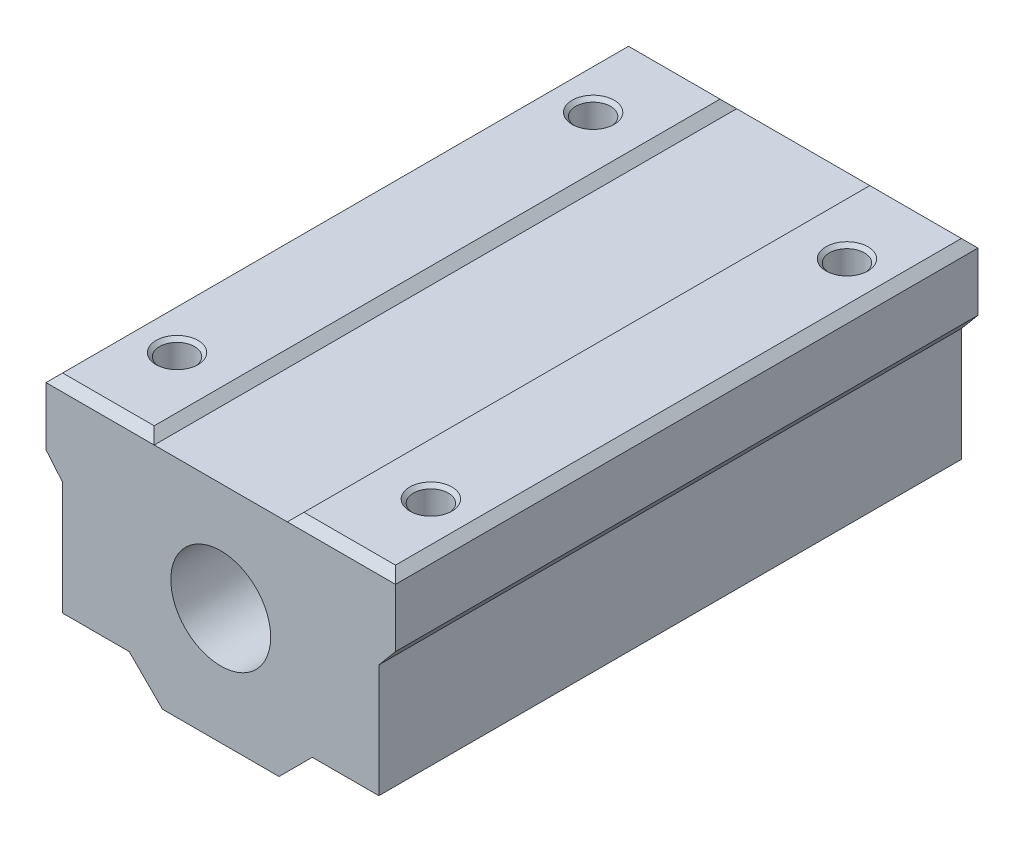
ISO-10303-21;
HEADER;
FILE_DESCRIPTION(('STEP AP214'),'2;1');
FILE_NAME('part.step','',(''),(''),'','','');
FILE_SCHEMA(('AUTOMOTIVE_DESIGN { 1 0 10303 214 1 1 1 1 }'));
ENDSEC;
DATA;
#1=APPLICATION_CONTEXT('core data for automotive mechanical design processes');
#2=APPLICATION_PROTOCOL_DEFINITION('international standard','automotive_design',2000,#1);
#3=PRODUCT_CONTEXT('',#1,'mechanical');
#4=PRODUCT('Part','Part','',(#3));
#5=PRODUCT_RELATED_PRODUCT_CATEGORY('part','',(#4));
#6=PRODUCT_DEFINITION_FORMATION('','',#4);
#7=PRODUCT_DEFINITION_CONTEXT('part definition',#1,'design');
#8=PRODUCT_DEFINITION('design','',#6,#7);
#9=PRODUCT_DEFINITION_SHAPE('','',#8);
#10=(LENGTH_UNIT() NAMED_UNIT(*) SI_UNIT(.MILLI.,.METRE.));
#11=(NAMED_UNIT(*) PLANE_ANGLE_UNIT() SI_UNIT($,.RADIAN.));
#12=(NAMED_UNIT(*) SI_UNIT($,.STERADIAN.) SOLID_ANGLE_UNIT());
#13=UNCERTAINTY_MEASURE_WITH_UNIT(LENGTH_MEASURE(1.E-05),#10,'distance_accuracy_value','');
#14=(GEOMETRIC_REPRESENTATION_CONTEXT(3) GLOBAL_UNCERTAINTY_ASSIGNED_CONTEXT((#13)) GLOBAL_UNIT_ASSIGNED_CONTEXT((#10,
#11,#12)) REPRESENTATION_CONTEXT('',''));
#15=CARTESIAN_POINT('',(0.,0.,0.));
#16=DIRECTION('',(0.,0.,1.));
#17=DIRECTION('',(1.,0.,0.));
#18=AXIS2_PLACEMENT_3D('',#15,#16,#17);
#19=CARTESIAN_POINT('',(8.00000000000001,13.,-70.));
#20=DIRECTION('',(0.,1.,0.));
#21=DIRECTION('',(0.,0.,1.));
#22=AXIS2_PLACEMENT_3D('',#19,#20,#21);
#23=PLANE('',#22);
#24=DIRECTION('',(-1.,0.,0.));
#25=VECTOR('',#24,1.);
#26=CARTESIAN_POINT('',(8.00000000000001,13.,0.));
#27=LINE('',#26,#25);
#28=CARTESIAN_POINT('',(8.00000000000001,13.,0.));
#29=VERTEX_POINT('',#28);
#30=CARTESIAN_POINT('',(-8.,13.,0.));
#31=VERTEX_POINT('',#30);
#32=EDGE_CURVE('E188',#29,#31,#27,.T.);
#33=ORIENTED_EDGE('',*,*,#32,.F.);
#34=DIRECTION('',(0.,0.,1.));
#35=VECTOR('',#34,1.);
#36=CARTESIAN_POINT('',(8.00000000000001,13.,-70.));
#37=LINE('',#36,#35);
#38=CARTESIAN_POINT('',(8.00000000000001,13.,-70.));
#39=VERTEX_POINT('',#38);
#40=EDGE_CURVE('E295',#39,#29,#37,.T.);
#41=ORIENTED_EDGE('',*,*,#40,.F.);
#42=DIRECTION('',(-1.,0.,0.));
#43=VECTOR('',#42,1.);
#44=CARTESIAN_POINT('',(8.00000000000001,13.,-70.));
#45=LINE('',#44,#43);
#46=CARTESIAN_POINT('',(-8.,13.,-70.));
#47=VERTEX_POINT('',#46);
#48=EDGE_CURVE('E197',#39,#47,#45,.T.);
#49=ORIENTED_EDGE('',*,*,#48,.T.);
#50=DIRECTION('',(0.,0.,1.));
#51=VECTOR('',#50,1.);
#52=CARTESIAN_POINT('',(-8.,13.,-70.));
#53=LINE('',#52,#51);
#54=EDGE_CURVE('E291',#47,#31,#53,.T.);
#55=ORIENTED_EDGE('',*,*,#54,.T.);
#56=EDGE_LOOP('',(#33,#41,#49,#55));
#57=FACE_BOUND('',#56,.T.);
#58=ADVANCED_FACE('F46',(#57),#23,.T.);
#59=CARTESIAN_POINT('',(8.00000000000001,14.,-70.));
#60=DIRECTION('',(0.,1.,0.));
#61=DIRECTION('',(-1.,0.,0.));
#62=AXIS2_PLACEMENT_3D('',#59,#60,#61);
#63=PLANE('',#62);
#64=CARTESIAN_POINT('',(15.25,14.,-10.));
#65=DIRECTION('',(0.,1.,0.));
#66=DIRECTION('',(0.,0.,1.));
#67=AXIS2_PLACEMENT_3D('',#64,#65,#66);
#68=CIRCLE('',#67,2.525);
#69=CARTESIAN_POINT('',(15.25,14.,-7.475));
#70=VERTEX_POINT('',#69);
#71=EDGE_CURVE('E689',#70,#70,#68,.T.);
#72=ORIENTED_EDGE('',*,*,#71,.F.);
#73=EDGE_LOOP('',(#72));
#74=FACE_BOUND('',#73,.T.);
#75=CARTESIAN_POINT('',(15.25,14.,-60.));
#76=DIRECTION('',(0.,1.,0.));
#77=DIRECTION('',(0.,0.,1.));
#78=AXIS2_PLACEMENT_3D('',#75,#76,#77);
#79=CIRCLE('',#78,2.525);
#80=CARTESIAN_POINT('',(15.25,14.,-57.475));
#81=VERTEX_POINT('',#80);
#82=EDGE_CURVE('E588',#81,#81,#79,.T.);
#83=ORIENTED_EDGE('',*,*,#82,.F.);
#84=EDGE_LOOP('',(#83));
#85=FACE_BOUND('',#84,.T.);
#86=DIRECTION('',(0.,0.,-1.));
#87=VECTOR('',#86,1.);
#88=CARTESIAN_POINT('',(20.,14.,-70.));
#89=LINE('',#88,#87);
#90=CARTESIAN_POINT('',(20.,14.,-1.));
#91=VERTEX_POINT('',#90);
#92=CARTESIAN_POINT('',(20.,14.,-69.));
#93=VERTEX_POINT('',#92);
#94=EDGE_CURVE('E330',#91,#93,#89,.T.);
#95=ORIENTED_EDGE('',*,*,#94,.T.);
#96=DIRECTION('',(-1.,0.,0.));
#97=VECTOR('',#96,1.);
#98=CARTESIAN_POINT('',(8.00000000000001,14.,-69.));
#99=LINE('',#98,#97);
#100=CARTESIAN_POINT('',(9.00000000000002,14.,-69.));
#101=VERTEX_POINT('',#100);
#102=EDGE_CURVE('E333',#93,#101,#99,.T.);
#103=ORIENTED_EDGE('',*,*,#102,.T.);
#104=DIRECTION('',(0.,0.,1.));
#105=VECTOR('',#104,1.);
#106=CARTESIAN_POINT('',(9.00000000000002,14.,-70.));
#107=LINE('',#106,#105);
#108=CARTESIAN_POINT('',(9.00000000000002,14.,-1.));
#109=VERTEX_POINT('',#108);
#110=EDGE_CURVE('E294',#101,#109,#107,.T.);
#111=ORIENTED_EDGE('',*,*,#110,.T.);
#112=DIRECTION('',(1.,0.,0.));
#113=VECTOR('',#112,1.);
#114=CARTESIAN_POINT('',(8.00000000000001,14.,-1.));
#115=LINE('',#114,#113);
#116=EDGE_CURVE('E327',#109,#91,#115,.T.);
#117=ORIENTED_EDGE('',*,*,#116,.T.);
#118=EDGE_LOOP('',(#95,#103,#111,#117));
#119=FACE_BOUND('',#118,.T.);
#120=ADVANCED_FACE('F440',(#74,#85,#119),#63,.T.);
#121=CARTESIAN_POINT('',(21.,14.,-70.));
#122=DIRECTION('',(1.,0.,0.));
#123=DIRECTION('',(0.,1.,0.));
#124=AXIS2_PLACEMENT_3D('',#121,#122,#123);
#125=PLANE('',#124);
#126=DIRECTION('',(0.,1.,0.));
#127=VECTOR('',#126,1.);
#128=CARTESIAN_POINT('',(21.,14.,-70.));
#129=LINE('',#128,#127);
#130=CARTESIAN_POINT('',(21.,6.,-70.));
#131=VERTEX_POINT('',#130);
#132=CARTESIAN_POINT('',(21.,13.,-70.));
#133=VERTEX_POINT('',#132);
#134=EDGE_CURVE('E239',#131,#133,#129,.T.);
#135=ORIENTED_EDGE('',*,*,#134,.T.);
#136=DIRECTION('',(0.,0.,1.));
#137=VECTOR('',#136,1.);
#138=CARTESIAN_POINT('',(21.,13.,-70.));
#139=LINE('',#138,#137);
#140=CARTESIAN_POINT('',(21.,13.,0.));
#141=VERTEX_POINT('',#140);
#142=EDGE_CURVE('E344',#133,#141,#139,.T.);
#143=ORIENTED_EDGE('',*,*,#142,.T.);
#144=DIRECTION('',(0.,1.,0.));
#145=VECTOR('',#144,1.);
#146=CARTESIAN_POINT('',(21.,14.,0.));
#147=LINE('',#146,#145);
#148=CARTESIAN_POINT('',(21.,6.,0.));
#149=VERTEX_POINT('',#148);
#150=EDGE_CURVE('E284',#149,#141,#147,.T.);
#151=ORIENTED_EDGE('',*,*,#150,.F.);
#152=DIRECTION('',(0.,0.,1.));
#153=VECTOR('',#152,1.);
#154=CARTESIAN_POINT('',(21.,6.,-70.));
#155=LINE('',#154,#153);
#156=EDGE_CURVE('E299',#131,#149,#155,.T.);
#157=ORIENTED_EDGE('',*,*,#156,.F.);
#158=EDGE_LOOP('',(#135,#143,#151,#157));
#159=FACE_BOUND('',#158,.T.);
#160=ADVANCED_FACE('F446',(#159),#125,.T.);
#161=CARTESIAN_POINT('',(21.,6.,-70.));
#162=DIRECTION('',(0.766044443118977,-0.64278760968654,0.));
#163=DIRECTION('',(0.64278760968654,0.766044443118977,0.));
#164=AXIS2_PLACEMENT_3D('',#161,#162,#163);
#165=PLANE('',#164);
#166=DIRECTION('',(0.64278760968654,0.766044443118977,0.));
#167=VECTOR('',#166,1.);
#168=CARTESIAN_POINT('',(21.,6.,0.));
#169=LINE('',#168,#167);
#170=CARTESIAN_POINT('',(19.,3.61649281481158,0.));
#171=VERTEX_POINT('',#170);
#172=EDGE_CURVE('E280',#171,#149,#169,.T.);
#173=ORIENTED_EDGE('',*,*,#172,.F.);
#174=DIRECTION('',(0.,0.,1.));
#175=VECTOR('',#174,1.);
#176=CARTESIAN_POINT('',(19.,3.61649281481158,-70.));
#177=LINE('',#176,#175);
#178=CARTESIAN_POINT('',(19.,3.61649281481158,-70.));
#179=VERTEX_POINT('',#178);
#180=EDGE_CURVE('E302',#179,#171,#177,.T.);
#181=ORIENTED_EDGE('',*,*,#180,.F.);
#182=DIRECTION('',(0.64278760968654,0.766044443118977,0.));
#183=VECTOR('',#182,1.);
#184=CARTESIAN_POINT('',(21.,6.,-70.));
#185=LINE('',#184,#183);
#186=EDGE_CURVE('E235',#179,#131,#185,.T.);
#187=ORIENTED_EDGE('',*,*,#186,.T.);
#188=ORIENTED_EDGE('',*,*,#156,.T.);
#189=EDGE_LOOP('',(#173,#181,#187,#188));
#190=FACE_BOUND('',#189,.T.);
#191=ADVANCED_FACE('F456',(#190),#165,.T.);
#192=CARTESIAN_POINT('',(19.,3.61649281481158,-70.));
#193=DIRECTION('',(1.,0.,0.));
#194=DIRECTION('',(0.,0.,-1.));
#195=AXIS2_PLACEMENT_3D('',#192,#193,#194);
#196=PLANE('',#195);
#197=DIRECTION('',(0.,1.,0.));
#198=VECTOR('',#197,1.);
#199=CARTESIAN_POINT('',(19.,3.61649281481158,0.));
#200=LINE('',#199,#198);
#201=CARTESIAN_POINT('',(19.,-10.,0.));
#202=VERTEX_POINT('',#201);
#203=EDGE_CURVE('E276',#202,#171,#200,.T.);
#204=ORIENTED_EDGE('',*,*,#203,.F.);
#205=DIRECTION('',(0.,0.,1.));
#206=VECTOR('',#205,1.);
#207=CARTESIAN_POINT('',(19.,-10.,-70.));
#208=LINE('',#207,#206);
#209=CARTESIAN_POINT('',(19.,-10.,-70.));
#210=VERTEX_POINT('',#209);
#211=EDGE_CURVE('E305',#210,#202,#208,.T.);
#212=ORIENTED_EDGE('',*,*,#211,.F.);
#213=DIRECTION('',(0.,1.,0.));
#214=VECTOR('',#213,1.);
#215=CARTESIAN_POINT('',(19.,3.61649281481158,-70.));
#216=LINE('',#215,#214);
#217=EDGE_CURVE('E231',#210,#179,#216,.T.);
#218=ORIENTED_EDGE('',*,*,#217,.T.);
#219=ORIENTED_EDGE('',*,*,#180,.T.);
#220=EDGE_LOOP('',(#204,#212,#218,#219));
#221=FACE_BOUND('',#220,.T.);
#222=ADVANCED_FACE('F460',(#221),#196,.T.);
#223=CARTESIAN_POINT('',(19.,-10.,-70.));
#224=DIRECTION('',(0.,-1.,0.));
#225=DIRECTION('',(1.,0.,0.));
#226=AXIS2_PLACEMENT_3D('',#223,#224,#225);
#227=PLANE('',#226);
#228=CARTESIAN_POINT('',(15.25,-10.,-60.));
#229=DIRECTION('',(0.,-1.,0.));
#230=DIRECTION('',(1.,0.,0.));
#231=AXIS2_PLACEMENT_3D('',#228,#229,#230);
#232=CIRCLE('',#231,3.10000000000003);
#233=CARTESIAN_POINT('',(18.35,-10.,-60.));
#234=VERTEX_POINT('',#233);
#235=EDGE_CURVE('E403',#234,#234,#232,.F.);
#236=ORIENTED_EDGE('',*,*,#235,.T.);
#237=EDGE_LOOP('',(#236));
#238=FACE_BOUND('',#237,.T.);
#239=CARTESIAN_POINT('',(15.25,-10.,-10.));
#240=DIRECTION('',(0.,-1.,0.));
#241=DIRECTION('',(1.,0.,0.));
#242=AXIS2_PLACEMENT_3D('',#239,#240,#241);
#243=CIRCLE('',#242,3.10000000000003);
#244=CARTESIAN_POINT('',(18.35,-10.,-10.));
#245=VERTEX_POINT('',#244);
#246=EDGE_CURVE('E399',#245,#245,#243,.F.);
#247=ORIENTED_EDGE('',*,*,#246,.T.);
#248=EDGE_LOOP('',(#247));
#249=FACE_BOUND('',#248,.T.);
#250=DIRECTION('',(1.,0.,0.));
#251=VECTOR('',#250,1.);
#252=CARTESIAN_POINT('',(19.,-10.,0.));
#253=LINE('',#252,#251);
#254=CARTESIAN_POINT('',(11.,-10.,0.));
#255=VERTEX_POINT('',#254);
#256=EDGE_CURVE('E272',#255,#202,#253,.T.);
#257=ORIENTED_EDGE('',*,*,#256,.F.);
#258=DIRECTION('',(0.,0.,1.));
#259=VECTOR('',#258,1.);
#260=CARTESIAN_POINT('',(11.,-10.,-70.));
#261=LINE('',#260,#259);
#262=CARTESIAN_POINT('',(11.,-10.,-70.));
#263=VERTEX_POINT('',#262);
#264=EDGE_CURVE('E308',#263,#255,#261,.T.);
#265=ORIENTED_EDGE('',*,*,#264,.F.);
#266=DIRECTION('',(1.,0.,0.));
#267=VECTOR('',#266,1.);
#268=CARTESIAN_POINT('',(19.,-10.,-70.));
#269=LINE('',#268,#267);
#270=EDGE_CURVE('E227',#263,#210,#269,.T.);
#271=ORIENTED_EDGE('',*,*,#270,.T.);
#272=ORIENTED_EDGE('',*,*,#211,.T.);
#273=EDGE_LOOP('',(#257,#265,#271,#272));
#274=FACE_BOUND('',#273,.T.);
#275=ADVANCED_FACE('F464',(#238,#249,#274),#227,.T.);
#276=CARTESIAN_POINT('',(11.,-10.,-70.));
#277=DIRECTION('',(0.707106781186549,-0.707106781186547,0.));
#278=DIRECTION('',(0.707106781186546,0.707106781186549,0.));
#279=AXIS2_PLACEMENT_3D('',#276,#277,#278);
#280=PLANE('',#279);
#281=DIRECTION('',(0.707106781186547,0.707106781186549,0.));
#282=VECTOR('',#281,1.);
#283=CARTESIAN_POINT('',(11.,-10.,0.));
#284=LINE('',#283,#282);
#285=CARTESIAN_POINT('',(7.,-14.,0.));
#286=VERTEX_POINT('',#285);
#287=EDGE_CURVE('E268',#286,#255,#284,.T.);
#288=ORIENTED_EDGE('',*,*,#287,.F.);
#289=DIRECTION('',(0.,0.,1.));
#290=VECTOR('',#289,1.);
#291=CARTESIAN_POINT('',(7.,-14.,-70.));
#292=LINE('',#291,#290);
#293=CARTESIAN_POINT('',(7.,-14.,-70.));
#294=VERTEX_POINT('',#293);
#295=EDGE_CURVE('E311',#294,#286,#292,.T.);
#296=ORIENTED_EDGE('',*,*,#295,.F.);
#297=DIRECTION('',(0.707106781186547,0.707106781186549,0.));
#298=VECTOR('',#297,1.);
#299=CARTESIAN_POINT('',(11.,-10.,-70.));
#300=LINE('',#299,#298);
#301=EDGE_CURVE('E223',#294,#263,#300,.T.);
#302=ORIENTED_EDGE('',*,*,#301,.T.);
#303=ORIENTED_EDGE('',*,*,#264,.T.);
#304=EDGE_LOOP('',(#288,#296,#302,#303));
#305=FACE_BOUND('',#304,.T.);
#306=ADVANCED_FACE('F468',(#305),#280,.T.);
#307=CARTESIAN_POINT('',(7.,-14.,-70.));
#308=DIRECTION('',(0.,-1.,0.));
#309=DIRECTION('',(1.,0.,0.));
#310=AXIS2_PLACEMENT_3D('',#307,#308,#309);
#311=PLANE('',#310);
#312=DIRECTION('',(1.,0.,0.));
#313=VECTOR('',#312,1.);
#314=CARTESIAN_POINT('',(7.,-14.,0.));
#315=LINE('',#314,#313);
#316=CARTESIAN_POINT('',(-7.,-14.,0.));
#317=VERTEX_POINT('',#316);
#318=EDGE_CURVE('E264',#317,#286,#315,.T.);
#319=ORIENTED_EDGE('',*,*,#318,.F.);
#320=DIRECTION('',(0.,0.,1.));
#321=VECTOR('',#320,1.);
#322=CARTESIAN_POINT('',(-7.,-14.,-70.));
#323=LINE('',#322,#321);
#324=CARTESIAN_POINT('',(-7.,-14.,-70.));
#325=VERTEX_POINT('',#324);
#326=EDGE_CURVE('E314',#325,#317,#323,.T.);
#327=ORIENTED_EDGE('',*,*,#326,.F.);
#328=DIRECTION('',(1.,0.,0.));
#329=VECTOR('',#328,1.);
#330=CARTESIAN_POINT('',(7.,-14.,-70.));
#331=LINE('',#330,#329);
#332=EDGE_CURVE('E219',#325,#294,#331,.T.);
#333=ORIENTED_EDGE('',*,*,#332,.T.);
#334=ORIENTED_EDGE('',*,*,#295,.T.);
#335=EDGE_LOOP('',(#319,#327,#333,#334));
#336=FACE_BOUND('',#335,.T.);
#337=ADVANCED_FACE('F472',(#336),#311,.T.);
#338=CARTESIAN_POINT('',(-11.,-10.,-70.));
#339=DIRECTION('',(-0.707106781186548,-0.707106781186547,0.));
#340=DIRECTION('',(0.707106781186547,-0.707106781186548,0.));
#341=AXIS2_PLACEMENT_3D('',#338,#339,#340);
#342=PLANE('',#341);
#343=DIRECTION('',(0.707106781186547,-0.707106781186548,0.));
#344=VECTOR('',#343,1.);
#345=CARTESIAN_POINT('',(-11.,-10.,0.));
#346=LINE('',#345,#344);
#347=CARTESIAN_POINT('',(-11.,-10.,0.));
#348=VERTEX_POINT('',#347);
#349=EDGE_CURVE('E260',#348,#317,#346,.T.);
#350=ORIENTED_EDGE('',*,*,#349,.F.);
#351=DIRECTION('',(0.,0.,1.));
#352=VECTOR('',#351,1.);
#353=CARTESIAN_POINT('',(-11.,-10.,-70.));
#354=LINE('',#353,#352);
#355=CARTESIAN_POINT('',(-11.,-10.,-70.));
#356=VERTEX_POINT('',#355);
#357=EDGE_CURVE('E317',#356,#348,#354,.T.);
#358=ORIENTED_EDGE('',*,*,#357,.F.);
#359=DIRECTION('',(0.707106781186547,-0.707106781186548,0.));
#360=VECTOR('',#359,1.);
#361=CARTESIAN_POINT('',(-11.,-10.,-70.));
#362=LINE('',#361,#360);
#363=EDGE_CURVE('E215',#356,#325,#362,.T.);
#364=ORIENTED_EDGE('',*,*,#363,.T.);
#365=ORIENTED_EDGE('',*,*,#326,.T.);
#366=EDGE_LOOP('',(#350,#358,#364,#365));
#367=FACE_BOUND('',#366,.T.);
#368=ADVANCED_FACE('F476',(#367),#342,.T.);
#369=CARTESIAN_POINT('',(-19.,-10.,-70.));
#370=DIRECTION('',(0.,-1.,0.));
#371=DIRECTION('',(0.,0.,-1.));
#372=AXIS2_PLACEMENT_3D('',#369,#370,#371);
#373=PLANE('',#372);
#374=CARTESIAN_POINT('',(-15.25,-10.,-60.));
#375=DIRECTION('',(0.,-1.,0.));
#376=DIRECTION('',(0.,0.,-1.));
#377=AXIS2_PLACEMENT_3D('',#374,#375,#376);
#378=CIRCLE('',#377,3.09999999999999);
#379=CARTESIAN_POINT('',(-15.25,-10.,-63.1));
#380=VERTEX_POINT('',#379);
#381=EDGE_CURVE('E415',#380,#380,#378,.F.);
#382=ORIENTED_EDGE('',*,*,#381,.T.);
#383=EDGE_LOOP('',(#382));
#384=FACE_BOUND('',#383,.T.);
#385=CARTESIAN_POINT('',(-15.25,-10.,-10.));
#386=DIRECTION('',(0.,-1.,0.));
#387=DIRECTION('',(0.,0.,-1.));
#388=AXIS2_PLACEMENT_3D('',#385,#386,#387);
#389=CIRCLE('',#388,3.1);
#390=CARTESIAN_POINT('',(-15.25,-10.,-13.1));
#391=VERTEX_POINT('',#390);
#392=EDGE_CURVE('E411',#391,#391,#389,.F.);
#393=ORIENTED_EDGE('',*,*,#392,.T.);
#394=EDGE_LOOP('',(#393));
#395=FACE_BOUND('',#394,.T.);
#396=DIRECTION('',(1.,0.,0.));
#397=VECTOR('',#396,1.);
#398=CARTESIAN_POINT('',(-19.,-10.,0.));
#399=LINE('',#398,#397);
#400=CARTESIAN_POINT('',(-19.,-10.,0.));
#401=VERTEX_POINT('',#400);
#402=EDGE_CURVE('E256',#401,#348,#399,.T.);
#403=ORIENTED_EDGE('',*,*,#402,.F.);
#404=DIRECTION('',(0.,0.,1.));
#405=VECTOR('',#404,1.);
#406=CARTESIAN_POINT('',(-19.,-10.,-70.));
#407=LINE('',#406,#405);
#408=CARTESIAN_POINT('',(-19.,-10.,-70.));
#409=VERTEX_POINT('',#408);
#410=EDGE_CURVE('E320',#409,#401,#407,.T.);
#411=ORIENTED_EDGE('',*,*,#410,.F.);
#412=DIRECTION('',(1.,0.,0.));
#413=VECTOR('',#412,1.);
#414=CARTESIAN_POINT('',(-19.,-10.,-70.));
#415=LINE('',#414,#413);
#416=EDGE_CURVE('E208',#409,#356,#415,.T.);
#417=ORIENTED_EDGE('',*,*,#416,.T.);
#418=ORIENTED_EDGE('',*,*,#357,.T.);
#419=EDGE_LOOP('',(#403,#411,#417,#418));
#420=FACE_BOUND('',#419,.T.);
#421=ADVANCED_FACE('F480',(#384,#395,#420),#373,.T.);
#422=CARTESIAN_POINT('',(-19.,3.61649281481158,-70.));
#423=DIRECTION('',(-1.,0.,0.));
#424=DIRECTION('',(0.,0.,1.));
#425=AXIS2_PLACEMENT_3D('',#422,#423,#424);
#426=PLANE('',#425);
#427=DIRECTION('',(0.,-1.,0.));
#428=VECTOR('',#427,1.);
#429=CARTESIAN_POINT('',(-19.,3.61649281481158,0.));
#430=LINE('',#429,#428);
#431=CARTESIAN_POINT('',(-19.,3.61649281481158,0.));
#432=VERTEX_POINT('',#431);
#433=EDGE_CURVE('E252',#432,#401,#430,.T.);
#434=ORIENTED_EDGE('',*,*,#433,.F.);
#435=DIRECTION('',(0.,0.,1.));
#436=VECTOR('',#435,1.);
#437=CARTESIAN_POINT('',(-19.,3.61649281481158,-70.));
#438=LINE('',#437,#436);
#439=CARTESIAN_POINT('',(-19.,3.61649281481158,-70.));
#440=VERTEX_POINT('',#439);
#441=EDGE_CURVE('E196',#440,#432,#438,.T.);
#442=ORIENTED_EDGE('',*,*,#441,.F.);
#443=DIRECTION('',(0.,-1.,0.));
#444=VECTOR('',#443,1.);
#445=CARTESIAN_POINT('',(-19.,3.61649281481158,-70.));
#446=LINE('',#445,#444);
#447=EDGE_CURVE('E204',#440,#409,#446,.T.);
#448=ORIENTED_EDGE('',*,*,#447,.T.);
#449=ORIENTED_EDGE('',*,*,#410,.T.);
#450=EDGE_LOOP('',(#434,#442,#448,#449));
#451=FACE_BOUND('',#450,.T.);
#452=ADVANCED_FACE('F484',(#451),#426,.T.);
#453=CARTESIAN_POINT('',(-21.,6.,-70.));
#454=DIRECTION('',(-0.766044443118977,-0.64278760968654,0.));
#455=DIRECTION('',(0.64278760968654,-0.766044443118977,0.));
#456=AXIS2_PLACEMENT_3D('',#453,#454,#455);
#457=PLANE('',#456);
#458=DIRECTION('',(0.64278760968654,-0.766044443118977,0.));
#459=VECTOR('',#458,1.);
#460=CARTESIAN_POINT('',(-21.,6.,0.));
#461=LINE('',#460,#459);
#462=CARTESIAN_POINT('',(-21.,6.,0.));
#463=VERTEX_POINT('',#462);
#464=EDGE_CURVE('E194',#463,#432,#461,.T.);
#465=ORIENTED_EDGE('',*,*,#464,.F.);
#466=DIRECTION('',(0.,0.,1.));
#467=VECTOR('',#466,1.);
#468=CARTESIAN_POINT('',(-21.,6.,-70.));
#469=LINE('',#468,#467);
#470=CARTESIAN_POINT('',(-21.,6.,-70.));
#471=VERTEX_POINT('',#470);
#472=EDGE_CURVE('E179',#471,#463,#469,.T.);
#473=ORIENTED_EDGE('',*,*,#472,.F.);
#474=DIRECTION('',(0.64278760968654,-0.766044443118977,0.));
#475=VECTOR('',#474,1.);
#476=CARTESIAN_POINT('',(-21.,6.,-70.));
#477=LINE('',#476,#475);
#478=EDGE_CURVE('E187',#471,#440,#477,.T.);
#479=ORIENTED_EDGE('',*,*,#478,.T.);
#480=ORIENTED_EDGE('',*,*,#441,.T.);
#481=EDGE_LOOP('',(#465,#473,#479,#480));
#482=FACE_BOUND('',#481,.T.);
#483=ADVANCED_FACE('F192',(#482),#457,.T.);
#484=CARTESIAN_POINT('',(-21.,14.,-70.));
#485=DIRECTION('',(-1.,0.,0.));
#486=DIRECTION('',(0.,-1.,0.));
#487=AXIS2_PLACEMENT_3D('',#484,#485,#486);
#488=PLANE('',#487);
#489=DIRECTION('',(0.,-1.,0.));
#490=VECTOR('',#489,1.);
#491=CARTESIAN_POINT('',(-21.,14.,0.));
#492=LINE('',#491,#490);
#493=CARTESIAN_POINT('',(-21.,13.,0.));
#494=VERTEX_POINT('',#493);
#495=EDGE_CURVE('E246',#494,#463,#492,.T.);
#496=ORIENTED_EDGE('',*,*,#495,.F.);
#497=DIRECTION('',(0.,0.,-1.));
#498=VECTOR('',#497,1.);
#499=CARTESIAN_POINT('',(-21.,13.,-70.));
#500=LINE('',#499,#498);
#501=CARTESIAN_POINT('',(-21.,13.,-70.));
#502=VERTEX_POINT('',#501);
#503=EDGE_CURVE('E182',#494,#502,#500,.T.);
#504=ORIENTED_EDGE('',*,*,#503,.T.);
#505=DIRECTION('',(0.,-1.,0.));
#506=VECTOR('',#505,1.);
#507=CARTESIAN_POINT('',(-21.,14.,-70.));
#508=LINE('',#507,#506);
#509=EDGE_CURVE('E175',#502,#471,#508,.T.);
#510=ORIENTED_EDGE('',*,*,#509,.T.);
#511=ORIENTED_EDGE('',*,*,#472,.T.);
#512=EDGE_LOOP('',(#496,#504,#510,#511));
#513=FACE_BOUND('',#512,.T.);
#514=ADVANCED_FACE('F178',(#513),#488,.T.);
#515=CARTESIAN_POINT('',(-8.,14.,-70.));
#516=DIRECTION('',(0.,1.,0.));
#517=DIRECTION('',(-1.,0.,0.));
#518=AXIS2_PLACEMENT_3D('',#515,#516,#517);
#519=PLANE('',#518);
#520=CARTESIAN_POINT('',(-15.25,14.,-60.));
#521=DIRECTION('',(0.,1.,0.));
#522=DIRECTION('',(0.,0.,1.));
#523=AXIS2_PLACEMENT_3D('',#520,#521,#522);
#524=CIRCLE('',#523,2.525);
#525=CARTESIAN_POINT('',(-15.25,14.,-57.475));
#526=VERTEX_POINT('',#525);
#527=EDGE_CURVE('E587',#526,#526,#524,.T.);
#528=ORIENTED_EDGE('',*,*,#527,.F.);
#529=EDGE_LOOP('',(#528));
#530=FACE_BOUND('',#529,.T.);
#531=CARTESIAN_POINT('',(-15.25,14.,-10.));
#532=DIRECTION('',(0.,1.,0.));
#533=DIRECTION('',(0.,0.,1.));
#534=AXIS2_PLACEMENT_3D('',#531,#532,#533);
#535=CIRCLE('',#534,2.525);
#536=CARTESIAN_POINT('',(-15.25,14.,-7.475));
#537=VERTEX_POINT('',#536);
#538=EDGE_CURVE('E603',#537,#537,#535,.T.);
#539=ORIENTED_EDGE('',*,*,#538,.F.);
#540=EDGE_LOOP('',(#539));
#541=FACE_BOUND('',#540,.T.);
#542=DIRECTION('',(0.,0.,-1.));
#543=VECTOR('',#542,1.);
#544=CARTESIAN_POINT('',(-9.,14.,-70.));
#545=LINE('',#544,#543);
#546=CARTESIAN_POINT('',(-9.,14.,-1.));
#547=VERTEX_POINT('',#546);
#548=CARTESIAN_POINT('',(-9.,14.,-69.));
#549=VERTEX_POINT('',#548);
#550=EDGE_CURVE('E353',#547,#549,#545,.T.);
#551=ORIENTED_EDGE('',*,*,#550,.T.);
#552=DIRECTION('',(-1.,0.,0.));
#553=VECTOR('',#552,1.);
#554=CARTESIAN_POINT('',(-21.,14.,-69.));
#555=LINE('',#554,#553);
#556=CARTESIAN_POINT('',(-20.,14.,-69.));
#557=VERTEX_POINT('',#556);
#558=EDGE_CURVE('E361',#549,#557,#555,.T.);
#559=ORIENTED_EDGE('',*,*,#558,.T.);
#560=DIRECTION('',(0.,0.,1.));
#561=VECTOR('',#560,1.);
#562=CARTESIAN_POINT('',(-20.,14.,-70.));
#563=LINE('',#562,#561);
#564=CARTESIAN_POINT('',(-20.,14.,-1.));
#565=VERTEX_POINT('',#564);
#566=EDGE_CURVE('E70',#557,#565,#563,.T.);
#567=ORIENTED_EDGE('',*,*,#566,.T.);
#568=DIRECTION('',(1.,0.,0.));
#569=VECTOR('',#568,1.);
#570=CARTESIAN_POINT('',(-8.,14.,-1.));
#571=LINE('',#570,#569);
#572=EDGE_CURVE('E356',#565,#547,#571,.T.);
#573=ORIENTED_EDGE('',*,*,#572,.T.);
#574=EDGE_LOOP('',(#551,#559,#567,#573));
#575=FACE_BOUND('',#574,.T.);
#576=ADVANCED_FACE('F493',(#530,#541,#575),#519,.T.);
#577=CARTESIAN_POINT('',(0.,0.,-70.));
#578=DIRECTION('',(0.,0.,1.));
#579=DIRECTION('',(1.,0.,0.));
#580=AXIS2_PLACEMENT_3D('',#577,#578,#579);
#581=PLANE('',#580);
#582=CARTESIAN_POINT('',(0.,0.,-70.));
#583=DIRECTION('',(0.,0.,1.));
#584=DIRECTION('',(1.,0.,0.));
#585=AXIS2_PLACEMENT_3D('',#582,#583,#584);
#586=CIRCLE('',#585,6.);
#587=CARTESIAN_POINT('',(6.,0.,-70.));
#588=VERTEX_POINT('',#587);
#589=EDGE_CURVE('E249',#588,#588,#586,.T.);
#590=ORIENTED_EDGE('',*,*,#589,.T.);
#591=EDGE_LOOP('',(#590));
#592=FACE_BOUND('',#591,.T.);
#593=ORIENTED_EDGE('',*,*,#48,.F.);
#594=DIRECTION('',(1.,0.,0.));
#595=VECTOR('',#594,1.);
#596=CARTESIAN_POINT('',(21.,13.,-70.));
#597=LINE('',#596,#595);
#598=EDGE_CURVE('E340',#39,#133,#597,.T.);
#599=ORIENTED_EDGE('',*,*,#598,.T.);
#600=ORIENTED_EDGE('',*,*,#134,.F.);
#601=ORIENTED_EDGE('',*,*,#186,.F.);
#602=ORIENTED_EDGE('',*,*,#217,.F.);
#603=ORIENTED_EDGE('',*,*,#270,.F.);
#604=ORIENTED_EDGE('',*,*,#301,.F.);
#605=ORIENTED_EDGE('',*,*,#332,.F.);
#606=ORIENTED_EDGE('',*,*,#363,.F.);
#607=ORIENTED_EDGE('',*,*,#416,.F.);
#608=ORIENTED_EDGE('',*,*,#447,.F.);
#609=ORIENTED_EDGE('',*,*,#478,.F.);
#610=ORIENTED_EDGE('',*,*,#509,.F.);
#611=DIRECTION('',(1.,0.,0.));
#612=VECTOR('',#611,1.);
#613=CARTESIAN_POINT('',(-8.,13.,-70.));
#614=LINE('',#613,#612);
#615=EDGE_CURVE('E337',#502,#47,#614,.T.);
#616=ORIENTED_EDGE('',*,*,#615,.T.);
#617=EDGE_LOOP('',(#593,#599,#600,#601,#602,#603,#604,#605,#606,#607,#608,#609,#610,#616));
#618=FACE_BOUND('',#617,.T.);
#619=ADVANCED_FACE('F201',(#592,#618),#581,.F.);
#620=CARTESIAN_POINT('',(0.,0.,0.));
#621=DIRECTION('',(0.,0.,1.));
#622=DIRECTION('',(1.,0.,0.));
#623=AXIS2_PLACEMENT_3D('',#620,#621,#622);
#624=PLANE('',#623);
#625=CARTESIAN_POINT('',(0.,0.,0.));
#626=DIRECTION('',(0.,0.,1.));
#627=DIRECTION('',(1.,0.,0.));
#628=AXIS2_PLACEMENT_3D('',#625,#626,#627);
#629=CIRCLE('',#628,6.);
#630=CARTESIAN_POINT('',(6.,0.,0.));
#631=VERTEX_POINT('',#630);
#632=EDGE_CURVE('E382',#631,#631,#629,.T.);
#633=ORIENTED_EDGE('',*,*,#632,.F.);
#634=EDGE_LOOP('',(#633));
#635=FACE_BOUND('',#634,.T.);
#636=ORIENTED_EDGE('',*,*,#150,.T.);
#637=DIRECTION('',(-1.,0.,0.));
#638=VECTOR('',#637,1.);
#639=CARTESIAN_POINT('',(0.,13.,0.));
#640=LINE('',#639,#638);
#641=EDGE_CURVE('E350',#141,#29,#640,.T.);
#642=ORIENTED_EDGE('',*,*,#641,.T.);
#643=ORIENTED_EDGE('',*,*,#32,.T.);
#644=DIRECTION('',(-1.,0.,0.));
#645=VECTOR('',#644,1.);
#646=CARTESIAN_POINT('',(0.,13.,0.));
#647=LINE('',#646,#645);
#648=EDGE_CURVE('E347',#31,#494,#647,.T.);
#649=ORIENTED_EDGE('',*,*,#648,.T.);
#650=ORIENTED_EDGE('',*,*,#495,.T.);
#651=ORIENTED_EDGE('',*,*,#464,.T.);
#652=ORIENTED_EDGE('',*,*,#433,.T.);
#653=ORIENTED_EDGE('',*,*,#402,.T.);
#654=ORIENTED_EDGE('',*,*,#349,.T.);
#655=ORIENTED_EDGE('',*,*,#318,.T.);
#656=ORIENTED_EDGE('',*,*,#287,.T.);
#657=ORIENTED_EDGE('',*,*,#256,.T.);
#658=ORIENTED_EDGE('',*,*,#203,.T.);
#659=ORIENTED_EDGE('',*,*,#172,.T.);
#660=EDGE_LOOP('',(#636,#642,#643,#649,#650,#651,#652,#653,#654,#655,#656,#657,#658,#659));
#661=FACE_BOUND('',#660,.T.);
#662=ADVANCED_FACE('F451',(#635,#661),#624,.T.);
#663=CARTESIAN_POINT('',(0.,0.,-70.));
#664=DIRECTION('',(0.,0.,1.));
#665=DIRECTION('',(1.,0.,0.));
#666=AXIS2_PLACEMENT_3D('',#663,#664,#665);
#667=CYLINDRICAL_SURFACE('',#666,6.);
#668=ORIENTED_EDGE('',*,*,#589,.F.);
#669=EDGE_LOOP('',(#668));
#670=FACE_BOUND('',#669,.T.);
#671=ORIENTED_EDGE('',*,*,#632,.T.);
#672=EDGE_LOOP('',(#671));
#673=FACE_BOUND('',#672,.T.);
#674=ADVANCED_FACE('F526',(#670,#673),#667,.F.);
#675=CARTESIAN_POINT('',(0.,13.,0.));
#676=DIRECTION('',(0.,-0.707106781186546,-0.707106781186549));
#677=DIRECTION('',(-1.,0.,0.));
#678=AXIS2_PLACEMENT_3D('',#675,#676,#677);
#679=PLANE('',#678);
#680=DIRECTION('',(0.57735026918963,0.577350269189625,-0.577350269189623));
#681=VECTOR('',#680,1.);
#682=CARTESIAN_POINT('',(32.,36.9999999999998,-23.9999999999997));
#683=LINE('',#682,#681);
#684=EDGE_CURVE('E374',#29,#109,#683,.T.);
#685=ORIENTED_EDGE('',*,*,#684,.F.);
#686=ORIENTED_EDGE('',*,*,#641,.F.);
#687=DIRECTION('',(-0.577350269189627,0.577350269189627,-0.577350269189624));
#688=VECTOR('',#687,1.);
#689=CARTESIAN_POINT('',(14.,20.,-6.99999999999999));
#690=LINE('',#689,#688);
#691=EDGE_CURVE('E378',#91,#141,#690,.F.);
#692=ORIENTED_EDGE('',*,*,#691,.F.);
#693=ORIENTED_EDGE('',*,*,#116,.F.);
#694=EDGE_LOOP('',(#685,#686,#692,#693));
#695=FACE_BOUND('',#694,.T.);
#696=ADVANCED_FACE('F520',(#695),#679,.F.);
#697=CARTESIAN_POINT('',(21.,13.,-70.));
#698=DIRECTION('',(-0.707106781186547,-0.707106781186547,0.));
#699=DIRECTION('',(0.,0.,1.));
#700=AXIS2_PLACEMENT_3D('',#697,#698,#699);
#701=PLANE('',#700);
#702=ORIENTED_EDGE('',*,*,#691,.T.);
#703=ORIENTED_EDGE('',*,*,#142,.F.);
#704=DIRECTION('',(0.577350269189627,-0.577350269189627,-0.577350269189624));
#705=VECTOR('',#704,1.);
#706=CARTESIAN_POINT('',(21.,13.,-70.));
#707=LINE('',#706,#705);
#708=EDGE_CURVE('E370',#93,#133,#707,.T.);
#709=ORIENTED_EDGE('',*,*,#708,.F.);
#710=ORIENTED_EDGE('',*,*,#94,.F.);
#711=EDGE_LOOP('',(#702,#703,#709,#710));
#712=FACE_BOUND('',#711,.T.);
#713=ADVANCED_FACE('F513',(#712),#701,.F.);
#714=CARTESIAN_POINT('',(9.00000000000002,14.,-70.));
#715=DIRECTION('',(0.707106781186544,-0.707106781186551,0.));
#716=DIRECTION('',(0.,0.,1.));
#717=AXIS2_PLACEMENT_3D('',#714,#715,#716);
#718=PLANE('',#717);
#719=ORIENTED_EDGE('',*,*,#684,.T.);
#720=ORIENTED_EDGE('',*,*,#110,.F.);
#721=DIRECTION('',(0.57735026918963,0.577350269189625,0.577350269189623));
#722=VECTOR('',#721,1.);
#723=CARTESIAN_POINT('',(8.66666666666668,13.6666666666667,-69.3333333333333));
#724=LINE('',#723,#722);
#725=EDGE_CURVE('E367',#39,#101,#724,.T.);
#726=ORIENTED_EDGE('',*,*,#725,.F.);
#727=ORIENTED_EDGE('',*,*,#40,.T.);
#728=EDGE_LOOP('',(#719,#720,#726,#727));
#729=FACE_BOUND('',#728,.T.);
#730=ADVANCED_FACE('F506',(#729),#718,.F.);
#731=CARTESIAN_POINT('',(8.00000000000001,14.,-69.));
#732=DIRECTION('',(0.,0.707106781186546,-0.707106781186549));
#733=DIRECTION('',(1.,0.,0.));
#734=AXIS2_PLACEMENT_3D('',#731,#732,#733);
#735=PLANE('',#734);
#736=ORIENTED_EDGE('',*,*,#708,.T.);
#737=ORIENTED_EDGE('',*,*,#598,.F.);
#738=ORIENTED_EDGE('',*,*,#725,.T.);
#739=ORIENTED_EDGE('',*,*,#102,.F.);
#740=EDGE_LOOP('',(#736,#737,#738,#739));
#741=FACE_BOUND('',#740,.T.);
#742=ADVANCED_FACE('F498',(#741),#735,.T.);
#743=CARTESIAN_POINT('',(0.,13.,0.));
#744=DIRECTION('',(0.,-0.707106781186551,-0.707106781186544));
#745=DIRECTION('',(-1.,0.,0.));
#746=AXIS2_PLACEMENT_3D('',#743,#744,#745);
#747=PLANE('',#746);
#748=DIRECTION('',(-0.577350269189627,-0.577350269189623,0.577350269189628));
#749=VECTOR('',#748,1.);
#750=CARTESIAN_POINT('',(-14.,20.,-7.00000000000004));
#751=LINE('',#750,#749);
#752=EDGE_CURVE('E389',#494,#565,#751,.F.);
#753=ORIENTED_EDGE('',*,*,#752,.F.);
#754=ORIENTED_EDGE('',*,*,#648,.F.);
#755=DIRECTION('',(0.577350269189625,-0.577350269189624,0.577350269189629));
#756=VECTOR('',#755,1.);
#757=CARTESIAN_POINT('',(-31.3333333333334,36.3333333333334,-23.3333333333336));
#758=LINE('',#757,#756);
#759=EDGE_CURVE('E371',#547,#31,#758,.T.);
#760=ORIENTED_EDGE('',*,*,#759,.F.);
#761=ORIENTED_EDGE('',*,*,#572,.F.);
#762=EDGE_LOOP('',(#753,#754,#760,#761));
#763=FACE_BOUND('',#762,.T.);
#764=ADVANCED_FACE('F505',(#763),#747,.F.);
#765=CARTESIAN_POINT('',(-8.,13.,-70.));
#766=DIRECTION('',(-0.707106781186547,-0.707106781186548,0.));
#767=DIRECTION('',(0.,0.,1.));
#768=AXIS2_PLACEMENT_3D('',#765,#766,#767);
#769=PLANE('',#768);
#770=ORIENTED_EDGE('',*,*,#759,.T.);
#771=ORIENTED_EDGE('',*,*,#54,.F.);
#772=DIRECTION('',(0.577350269189625,-0.577350269189624,-0.577350269189629));
#773=VECTOR('',#772,1.);
#774=CARTESIAN_POINT('',(-8.,13.,-70.));
#775=LINE('',#774,#773);
#776=EDGE_CURVE('E385',#549,#47,#775,.T.);
#777=ORIENTED_EDGE('',*,*,#776,.F.);
#778=ORIENTED_EDGE('',*,*,#550,.F.);
#779=EDGE_LOOP('',(#770,#771,#777,#778));
#780=FACE_BOUND('',#779,.T.);
#781=ADVANCED_FACE('F542',(#780),#769,.F.);
#782=CARTESIAN_POINT('',(-20.,14.,-70.));
#783=DIRECTION('',(0.707106781186545,-0.70710678118655,0.));
#784=DIRECTION('',(0.,0.,1.));
#785=AXIS2_PLACEMENT_3D('',#782,#783,#784);
#786=PLANE('',#785);
#787=ORIENTED_EDGE('',*,*,#752,.T.);
#788=ORIENTED_EDGE('',*,*,#566,.F.);
#789=DIRECTION('',(0.577350269189627,0.577350269189623,0.577350269189628));
#790=VECTOR('',#789,1.);
#791=CARTESIAN_POINT('',(-20.3333333333333,13.6666666666667,-69.3333333333333));
#792=LINE('',#791,#790);
#793=EDGE_CURVE('E63',#502,#557,#792,.T.);
#794=ORIENTED_EDGE('',*,*,#793,.F.);
#795=ORIENTED_EDGE('',*,*,#503,.F.);
#796=EDGE_LOOP('',(#787,#788,#794,#795));
#797=FACE_BOUND('',#796,.T.);
#798=ADVANCED_FACE('F536',(#797),#786,.F.);
#799=CARTESIAN_POINT('',(-8.,14.,-69.));
#800=DIRECTION('',(0.,0.707106781186551,-0.707106781186544));
#801=DIRECTION('',(1.,0.,0.));
#802=AXIS2_PLACEMENT_3D('',#799,#800,#801);
#803=PLANE('',#802);
#804=ORIENTED_EDGE('',*,*,#776,.T.);
#805=ORIENTED_EDGE('',*,*,#615,.F.);
#806=ORIENTED_EDGE('',*,*,#793,.T.);
#807=ORIENTED_EDGE('',*,*,#558,.F.);
#808=EDGE_LOOP('',(#804,#805,#806,#807));
#809=FACE_BOUND('',#808,.T.);
#810=ADVANCED_FACE('F529',(#809),#803,.T.);
#811=CARTESIAN_POINT('',(-15.25,14.,-10.));
#812=DIRECTION('',(0.,1.,0.));
#813=DIRECTION('',(0.,0.,1.));
#814=AXIS2_PLACEMENT_3D('',#811,#812,#813);
#815=CYLINDRICAL_SURFACE('',#814,2.1);
#816=CARTESIAN_POINT('',(-15.25,-9.00000000000001,-10.));
#817=DIRECTION('',(0.,-1.,0.));
#818=DIRECTION('',(0.,0.,-1.));
#819=AXIS2_PLACEMENT_3D('',#816,#817,#818);
#820=CIRCLE('',#819,2.1);
#821=CARTESIAN_POINT('',(-15.25,-9.00000000000001,-12.1));
#822=VERTEX_POINT('',#821);
#823=EDGE_CURVE('E56',#822,#822,#820,.T.);
#824=ORIENTED_EDGE('',*,*,#823,.T.);
#825=EDGE_LOOP('',(#824));
#826=FACE_BOUND('',#825,.T.);
#827=CARTESIAN_POINT('',(-15.25,13.575,-10.));
#828=DIRECTION('',(0.,1.,0.));
#829=DIRECTION('',(0.,0.,1.));
#830=AXIS2_PLACEMENT_3D('',#827,#828,#829);
#831=CIRCLE('',#830,2.1);
#832=CARTESIAN_POINT('',(-15.25,13.575,-7.9));
#833=VERTEX_POINT('',#832);
#834=EDGE_CURVE('E386',#833,#833,#831,.T.);
#835=ORIENTED_EDGE('',*,*,#834,.T.);
#836=EDGE_LOOP('',(#835));
#837=FACE_BOUND('',#836,.T.);
#838=ADVANCED_FACE('F422',(#826,#837),#815,.F.);
#839=CARTESIAN_POINT('',(-15.25,14.,-10.));
#840=DIRECTION('',(0.,1.,0.));
#841=DIRECTION('',(0.,0.,1.));
#842=AXIS2_PLACEMENT_3D('',#839,#840,#841);
#843=CONICAL_SURFACE('',#842,2.525,0.785398163397444);
#844=ORIENTED_EDGE('',*,*,#834,.F.);
#845=EDGE_LOOP('',(#844));
#846=FACE_BOUND('',#845,.T.);
#847=ORIENTED_EDGE('',*,*,#538,.T.);
#848=EDGE_LOOP('',(#847));
#849=FACE_BOUND('',#848,.T.);
#850=ADVANCED_FACE('F667',(#846,#849),#843,.F.);
#851=CARTESIAN_POINT('',(-15.25,14.,-60.));
#852=DIRECTION('',(0.,1.,0.));
#853=DIRECTION('',(0.,0.,1.));
#854=AXIS2_PLACEMENT_3D('',#851,#852,#853);
#855=CYLINDRICAL_SURFACE('',#854,2.1);
#856=CARTESIAN_POINT('',(-15.25,-9.00000000000001,-60.));
#857=DIRECTION('',(0.,-1.,0.));
#858=DIRECTION('',(0.,0.,-1.));
#859=AXIS2_PLACEMENT_3D('',#856,#857,#858);
#860=CIRCLE('',#859,2.1);
#861=CARTESIAN_POINT('',(-15.25,-9.00000000000001,-62.1));
#862=VERTEX_POINT('',#861);
#863=EDGE_CURVE('E407',#862,#862,#860,.T.);
#864=ORIENTED_EDGE('',*,*,#863,.T.);
#865=EDGE_LOOP('',(#864));
#866=FACE_BOUND('',#865,.T.);
#867=CARTESIAN_POINT('',(-15.25,13.575,-60.));
#868=DIRECTION('',(0.,1.,0.));
#869=DIRECTION('',(0.,0.,1.));
#870=AXIS2_PLACEMENT_3D('',#867,#868,#869);
#871=CIRCLE('',#870,2.1);
#872=CARTESIAN_POINT('',(-15.25,13.575,-57.9));
#873=VERTEX_POINT('',#872);
#874=EDGE_CURVE('E593',#873,#873,#871,.T.);
#875=ORIENTED_EDGE('',*,*,#874,.T.);
#876=EDGE_LOOP('',(#875));
#877=FACE_BOUND('',#876,.T.);
#878=ADVANCED_FACE('F670',(#866,#877),#855,.F.);
#879=CARTESIAN_POINT('',(-15.25,14.,-60.));
#880=DIRECTION('',(0.,1.,0.));
#881=DIRECTION('',(0.,0.,1.));
#882=AXIS2_PLACEMENT_3D('',#879,#880,#881);
#883=CONICAL_SURFACE('',#882,2.525,0.785398163397444);
#884=ORIENTED_EDGE('',*,*,#874,.F.);
#885=EDGE_LOOP('',(#884));
#886=FACE_BOUND('',#885,.T.);
#887=ORIENTED_EDGE('',*,*,#527,.T.);
#888=EDGE_LOOP('',(#887));
#889=FACE_BOUND('',#888,.T.);
#890=ADVANCED_FACE('F580',(#886,#889),#883,.F.);
#891=CARTESIAN_POINT('',(15.25,14.,-60.));
#892=DIRECTION('',(0.,1.,0.));
#893=DIRECTION('',(0.,0.,1.));
#894=AXIS2_PLACEMENT_3D('',#891,#892,#893);
#895=CYLINDRICAL_SURFACE('',#894,2.1);
#896=CARTESIAN_POINT('',(15.25,-8.99999999999998,-60.));
#897=DIRECTION('',(0.,-1.,0.));
#898=DIRECTION('',(0.,0.,-1.));
#899=AXIS2_PLACEMENT_3D('',#896,#897,#898);
#900=CIRCLE('',#899,2.1);
#901=CARTESIAN_POINT('',(15.25,-8.99999999999998,-62.1));
#902=VERTEX_POINT('',#901);
#903=EDGE_CURVE('E366',#902,#902,#900,.T.);
#904=ORIENTED_EDGE('',*,*,#903,.T.);
#905=EDGE_LOOP('',(#904));
#906=FACE_BOUND('',#905,.T.);
#907=CARTESIAN_POINT('',(15.25,13.575,-60.));
#908=DIRECTION('',(0.,1.,0.));
#909=DIRECTION('',(0.,0.,1.));
#910=AXIS2_PLACEMENT_3D('',#907,#908,#909);
#911=CIRCLE('',#910,2.1);
#912=CARTESIAN_POINT('',(15.25,13.575,-57.9));
#913=VERTEX_POINT('',#912);
#914=EDGE_CURVE('E584',#913,#913,#911,.T.);
#915=ORIENTED_EDGE('',*,*,#914,.T.);
#916=EDGE_LOOP('',(#915));
#917=FACE_BOUND('',#916,.T.);
#918=ADVANCED_FACE('F576',(#906,#917),#895,.F.);
#919=CARTESIAN_POINT('',(15.25,14.,-60.));
#920=DIRECTION('',(0.,1.,0.));
#921=DIRECTION('',(0.,0.,1.));
#922=AXIS2_PLACEMENT_3D('',#919,#920,#921);
#923=CONICAL_SURFACE('',#922,2.525,0.785398163397444);
#924=ORIENTED_EDGE('',*,*,#914,.F.);
#925=EDGE_LOOP('',(#924));
#926=FACE_BOUND('',#925,.T.);
#927=ORIENTED_EDGE('',*,*,#82,.T.);
#928=EDGE_LOOP('',(#927));
#929=FACE_BOUND('',#928,.T.);
#930=ADVANCED_FACE('F579',(#926,#929),#923,.F.);
#931=CARTESIAN_POINT('',(15.25,14.,-10.));
#932=DIRECTION('',(0.,1.,0.));
#933=DIRECTION('',(0.,0.,1.));
#934=AXIS2_PLACEMENT_3D('',#931,#932,#933);
#935=CYLINDRICAL_SURFACE('',#934,2.1);
#936=CARTESIAN_POINT('',(15.25,-8.99999999999998,-10.));
#937=DIRECTION('',(0.,-1.,0.));
#938=DIRECTION('',(0.,0.,-1.));
#939=AXIS2_PLACEMENT_3D('',#936,#937,#938);
#940=CIRCLE('',#939,2.1);
#941=CARTESIAN_POINT('',(15.25,-8.99999999999998,-12.1));
#942=VERTEX_POINT('',#941);
#943=EDGE_CURVE('E11',#942,#942,#940,.T.);
#944=ORIENTED_EDGE('',*,*,#943,.T.);
#945=EDGE_LOOP('',(#944));
#946=FACE_BOUND('',#945,.T.);
#947=CARTESIAN_POINT('',(15.25,13.575,-10.));
#948=DIRECTION('',(0.,1.,0.));
#949=DIRECTION('',(0.,0.,1.));
#950=AXIS2_PLACEMENT_3D('',#947,#948,#949);
#951=CIRCLE('',#950,2.1);
#952=CARTESIAN_POINT('',(15.25,13.575,-7.9));
#953=VERTEX_POINT('',#952);
#954=EDGE_CURVE('E596',#953,#953,#951,.T.);
#955=ORIENTED_EDGE('',*,*,#954,.T.);
#956=EDGE_LOOP('',(#955));
#957=FACE_BOUND('',#956,.T.);
#958=ADVANCED_FACE('F569',(#946,#957),#935,.F.);
#959=CARTESIAN_POINT('',(15.25,14.,-10.));
#960=DIRECTION('',(0.,1.,0.));
#961=DIRECTION('',(0.,0.,1.));
#962=AXIS2_PLACEMENT_3D('',#959,#960,#961);
#963=CONICAL_SURFACE('',#962,2.525,0.785398163397444);
#964=ORIENTED_EDGE('',*,*,#954,.F.);
#965=EDGE_LOOP('',(#964));
#966=FACE_BOUND('',#965,.T.);
#967=ORIENTED_EDGE('',*,*,#71,.T.);
#968=EDGE_LOOP('',(#967));
#969=FACE_BOUND('',#968,.T.);
#970=ADVANCED_FACE('F558',(#966,#969),#963,.F.);
#971=CARTESIAN_POINT('',(15.25,-8.99999999999998,-60.));
#972=DIRECTION('',(0.,-1.,0.));
#973=DIRECTION('',(0.,0.,-1.));
#974=AXIS2_PLACEMENT_3D('',#971,#972,#973);
#975=CONICAL_SURFACE('',#974,2.1,0.785398163397452);
#976=ORIENTED_EDGE('',*,*,#235,.F.);
#977=EDGE_LOOP('',(#976));
#978=FACE_BOUND('',#977,.T.);
#979=ORIENTED_EDGE('',*,*,#903,.F.);
#980=EDGE_LOOP('',(#979));
#981=FACE_BOUND('',#980,.T.);
#982=ADVANCED_FACE('F434',(#978,#981),#975,.F.);
#983=CARTESIAN_POINT('',(-15.25,-9.00000000000001,-60.));
#984=DIRECTION('',(0.,-1.,0.));
#985=DIRECTION('',(0.,0.,-1.));
#986=AXIS2_PLACEMENT_3D('',#983,#984,#985);
#987=CONICAL_SURFACE('',#986,2.1,0.785398163397452);
#988=ORIENTED_EDGE('',*,*,#381,.F.);
#989=EDGE_LOOP('',(#988));
#990=FACE_BOUND('',#989,.T.);
#991=ORIENTED_EDGE('',*,*,#863,.F.);
#992=EDGE_LOOP('',(#991));
#993=FACE_BOUND('',#992,.T.);
#994=ADVANCED_FACE('F427',(#990,#993),#987,.F.);
#995=CARTESIAN_POINT('',(-15.25,-9.00000000000001,-10.));
#996=DIRECTION('',(0.,-1.,0.));
#997=DIRECTION('',(0.,0.,-1.));
#998=AXIS2_PLACEMENT_3D('',#995,#996,#997);
#999=CONICAL_SURFACE('',#998,2.1,0.785398163397452);
#1000=ORIENTED_EDGE('',*,*,#392,.F.);
#1001=EDGE_LOOP('',(#1000));
#1002=FACE_BOUND('',#1001,.T.);
#1003=ORIENTED_EDGE('',*,*,#823,.F.);
#1004=EDGE_LOOP('',(#1003));
#1005=FACE_BOUND('',#1004,.T.);
#1006=ADVANCED_FACE('F425',(#1002,#1005),#999,.F.);
#1007=CARTESIAN_POINT('',(15.25,-8.99999999999998,-10.));
#1008=DIRECTION('',(0.,-1.,0.));
#1009=DIRECTION('',(0.,0.,-1.));
#1010=AXIS2_PLACEMENT_3D('',#1007,#1008,#1009);
#1011=CONICAL_SURFACE('',#1010,2.1,0.785398163397452);
#1012=ORIENTED_EDGE('',*,*,#246,.F.);
#1013=EDGE_LOOP('',(#1012));
#1014=FACE_BOUND('',#1013,.T.);
#1015=ORIENTED_EDGE('',*,*,#943,.F.);
#1016=EDGE_LOOP('',(#1015));
#1017=FACE_BOUND('',#1016,.T.);
#1018=ADVANCED_FACE('F49',(#1014,#1017),#1011,.F.);
#1019=CLOSED_SHELL('',(#58,#120,#160,#191,#222,#275,#306,#337,#368,#421,#452,#483,#514,#576,
#619,#662,#674,#696,#713,#730,#742,#764,#781,#798,#810,#838,#850,#878,#890,#918,#930,#958,#970,
#982,#994,#1006,#1018));
#1020=MANIFOLD_SOLID_BREP('B2',#1019);
#1021=ADVANCED_BREP_SHAPE_REPRESENTATION('',(#18,#1020),#14);
#1022=SHAPE_DEFINITION_REPRESENTATION(#9,#1021);
ENDSEC;
END-ISO-10303-21;
